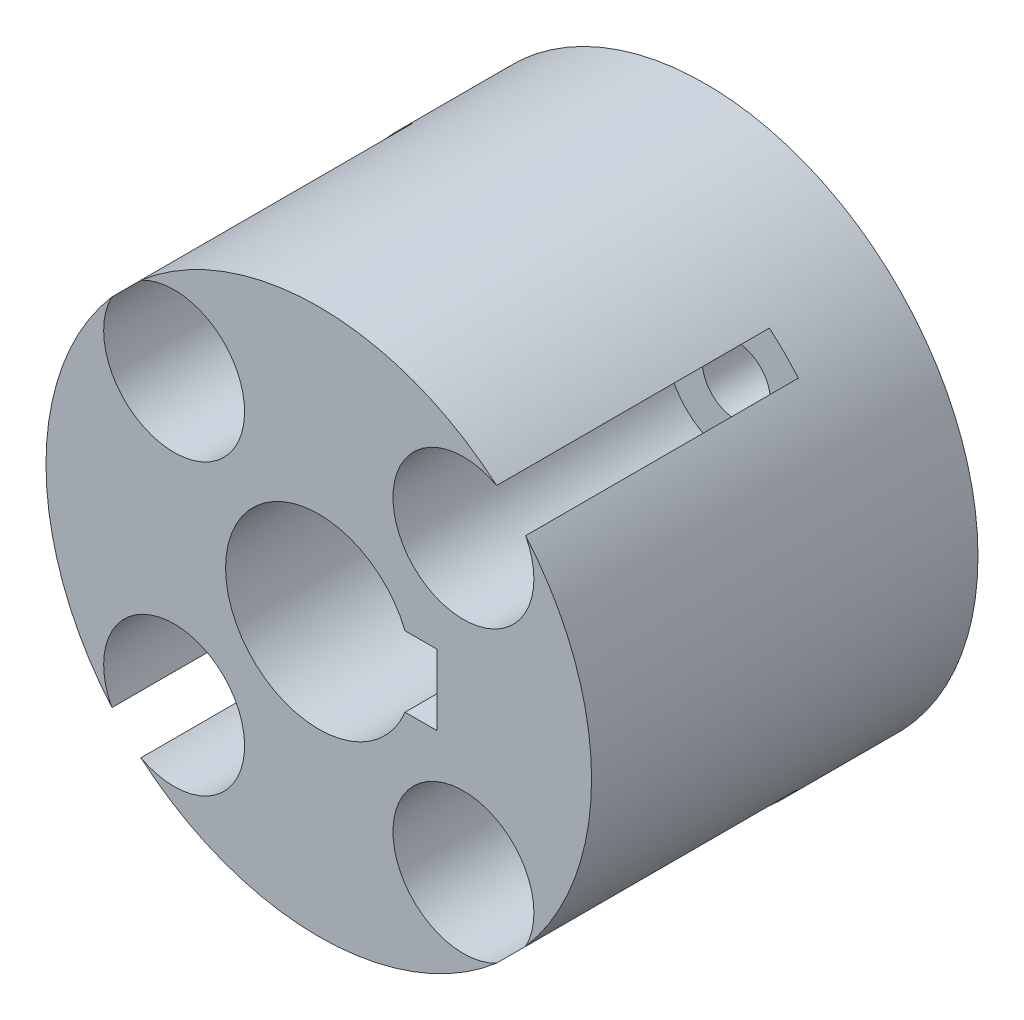
ISO-10303-21;
HEADER;
FILE_DESCRIPTION(('STEP AP214'),'2;1');
FILE_NAME('part.step','',(''),(''),'','','');
FILE_SCHEMA(('AUTOMOTIVE_DESIGN { 1 0 10303 214 1 1 1 1 }'));
ENDSEC;
DATA;
#1=APPLICATION_CONTEXT('core data for automotive mechanical design processes');
#2=APPLICATION_PROTOCOL_DEFINITION('international standard','automotive_design',2000,#1);
#3=PRODUCT_CONTEXT('',#1,'mechanical');
#4=PRODUCT('Part','Part','',(#3));
#5=PRODUCT_RELATED_PRODUCT_CATEGORY('part','',(#4));
#6=PRODUCT_DEFINITION_FORMATION('','',#4);
#7=PRODUCT_DEFINITION_CONTEXT('part definition',#1,'design');
#8=PRODUCT_DEFINITION('design','',#6,#7);
#9=PRODUCT_DEFINITION_SHAPE('','',#8);
#10=(LENGTH_UNIT() NAMED_UNIT(*) SI_UNIT(.MILLI.,.METRE.));
#11=(NAMED_UNIT(*) PLANE_ANGLE_UNIT() SI_UNIT($,.RADIAN.));
#12=(NAMED_UNIT(*) SI_UNIT($,.STERADIAN.) SOLID_ANGLE_UNIT());
#13=UNCERTAINTY_MEASURE_WITH_UNIT(LENGTH_MEASURE(1.E-05),#10,'distance_accuracy_value','');
#14=(GEOMETRIC_REPRESENTATION_CONTEXT(3) GLOBAL_UNCERTAINTY_ASSIGNED_CONTEXT((#13)) GLOBAL_UNIT_ASSIGNED_CONTEXT((#10,
#11,#12)) REPRESENTATION_CONTEXT('',''));
#15=CARTESIAN_POINT('',(0.,0.,0.));
#16=DIRECTION('',(0.,0.,1.));
#17=DIRECTION('',(1.,0.,0.));
#18=AXIS2_PLACEMENT_3D('',#15,#16,#17);
#19=CARTESIAN_POINT('',(-6.363961030679,-6.36396103067885,17.));
#20=DIRECTION('',(0.,0.,-1.));
#21=DIRECTION('',(-1.,0.,0.));
#22=AXIS2_PLACEMENT_3D('',#19,#20,#21);
#23=CYLINDRICAL_SURFACE('',#22,1.5);
#24=CARTESIAN_POINT('',(-6.363961030679,-6.36396103067885,0.));
#25=DIRECTION('',(0.,0.,1.));
#26=DIRECTION('',(1.,0.,0.));
#27=AXIS2_PLACEMENT_3D('',#24,#25,#26);
#28=CIRCLE('',#27,1.5);
#29=CARTESIAN_POINT('',(-4.86396103067901,-6.36396103067885,0.));
#30=VERTEX_POINT('',#29);
#31=EDGE_CURVE('E210',#30,#30,#28,.T.);
#32=ORIENTED_EDGE('',*,*,#31,.F.);
#33=EDGE_LOOP('',(#32));
#34=FACE_BOUND('',#33,.T.);
#35=CARTESIAN_POINT('',(-6.363961030679,-6.36396103067885,5.));
#36=DIRECTION('',(0.,0.,1.));
#37=DIRECTION('',(1.,0.,0.));
#38=AXIS2_PLACEMENT_3D('',#35,#36,#37);
#39=CIRCLE('',#38,1.5);
#40=CARTESIAN_POINT('',(-4.86396103067901,-6.36396103067885,5.));
#41=VERTEX_POINT('',#40);
#42=EDGE_CURVE('E47',#41,#41,#39,.T.);
#43=ORIENTED_EDGE('',*,*,#42,.T.);
#44=EDGE_LOOP('',(#43));
#45=FACE_BOUND('',#44,.T.);
#46=ADVANCED_FACE('F43',(#34,#45),#23,.F.);
#47=CARTESIAN_POINT('',(6.36396103067885,-6.363961030679,17.));
#48=DIRECTION('',(0.,0.,-1.));
#49=DIRECTION('',(-1.,0.,0.));
#50=AXIS2_PLACEMENT_3D('',#47,#48,#49);
#51=CYLINDRICAL_SURFACE('',#50,1.5);
#52=CARTESIAN_POINT('',(6.36396103067885,-6.363961030679,0.));
#53=DIRECTION('',(0.,0.,1.));
#54=DIRECTION('',(1.,0.,0.));
#55=AXIS2_PLACEMENT_3D('',#52,#53,#54);
#56=CIRCLE('',#55,1.5);
#57=CARTESIAN_POINT('',(7.86396103067885,-6.363961030679,0.));
#58=VERTEX_POINT('',#57);
#59=EDGE_CURVE('E207',#58,#58,#56,.T.);
#60=ORIENTED_EDGE('',*,*,#59,.F.);
#61=EDGE_LOOP('',(#60));
#62=FACE_BOUND('',#61,.T.);
#63=CARTESIAN_POINT('',(6.36396103067885,-6.363961030679,5.));
#64=DIRECTION('',(0.,0.,1.));
#65=DIRECTION('',(1.,0.,0.));
#66=AXIS2_PLACEMENT_3D('',#63,#64,#65);
#67=CIRCLE('',#66,1.5);
#68=CARTESIAN_POINT('',(7.86396103067885,-6.363961030679,5.));
#69=VERTEX_POINT('',#68);
#70=EDGE_CURVE('E178',#69,#69,#67,.T.);
#71=ORIENTED_EDGE('',*,*,#70,.T.);
#72=EDGE_LOOP('',(#71));
#73=FACE_BOUND('',#72,.T.);
#74=ADVANCED_FACE('F245',(#62,#73),#51,.F.);
#75=CARTESIAN_POINT('',(6.36396103067901,6.36396103067885,17.));
#76=DIRECTION('',(0.,0.,-1.));
#77=DIRECTION('',(-1.,0.,0.));
#78=AXIS2_PLACEMENT_3D('',#75,#76,#77);
#79=CYLINDRICAL_SURFACE('',#78,1.5);
#80=CARTESIAN_POINT('',(6.36396103067901,6.36396103067885,0.));
#81=DIRECTION('',(0.,0.,1.));
#82=DIRECTION('',(1.,0.,0.));
#83=AXIS2_PLACEMENT_3D('',#80,#81,#82);
#84=CIRCLE('',#83,1.5);
#85=CARTESIAN_POINT('',(7.863961030679,6.36396103067885,0.));
#86=VERTEX_POINT('',#85);
#87=EDGE_CURVE('E204',#86,#86,#84,.T.);
#88=ORIENTED_EDGE('',*,*,#87,.F.);
#89=EDGE_LOOP('',(#88));
#90=FACE_BOUND('',#89,.T.);
#91=CARTESIAN_POINT('',(6.36396103067901,6.36396103067885,5.));
#92=DIRECTION('',(0.,0.,1.));
#93=DIRECTION('',(1.,0.,0.));
#94=AXIS2_PLACEMENT_3D('',#91,#92,#93);
#95=CIRCLE('',#94,1.5);
#96=CARTESIAN_POINT('',(7.863961030679,6.36396103067885,5.));
#97=VERTEX_POINT('',#96);
#98=EDGE_CURVE('E142',#97,#97,#95,.T.);
#99=ORIENTED_EDGE('',*,*,#98,.T.);
#100=EDGE_LOOP('',(#99));
#101=FACE_BOUND('',#100,.T.);
#102=ADVANCED_FACE('F295',(#90,#101),#79,.F.);
#103=CARTESIAN_POINT('',(-6.36396103067885,6.36396103067901,17.));
#104=DIRECTION('',(0.,0.,-1.));
#105=DIRECTION('',(-1.,0.,0.));
#106=AXIS2_PLACEMENT_3D('',#103,#104,#105);
#107=CYLINDRICAL_SURFACE('',#106,1.5);
#108=CARTESIAN_POINT('',(-6.36396103067885,6.36396103067901,0.));
#109=DIRECTION('',(0.,0.,1.));
#110=DIRECTION('',(1.,0.,0.));
#111=AXIS2_PLACEMENT_3D('',#108,#109,#110);
#112=CIRCLE('',#111,1.5);
#113=CARTESIAN_POINT('',(-4.86396103067885,6.36396103067901,0.));
#114=VERTEX_POINT('',#113);
#115=EDGE_CURVE('E183',#114,#114,#112,.T.);
#116=ORIENTED_EDGE('',*,*,#115,.F.);
#117=EDGE_LOOP('',(#116));
#118=FACE_BOUND('',#117,.T.);
#119=CARTESIAN_POINT('',(-6.36396103067885,6.36396103067901,5.));
#120=DIRECTION('',(0.,0.,1.));
#121=DIRECTION('',(1.,0.,0.));
#122=AXIS2_PLACEMENT_3D('',#119,#120,#121);
#123=CIRCLE('',#122,1.5);
#124=CARTESIAN_POINT('',(-4.86396103067885,6.36396103067901,5.));
#125=VERTEX_POINT('',#124);
#126=EDGE_CURVE('E143',#125,#125,#123,.T.);
#127=ORIENTED_EDGE('',*,*,#126,.T.);
#128=EDGE_LOOP('',(#127));
#129=FACE_BOUND('',#128,.T.);
#130=ADVANCED_FACE('F45',(#118,#129),#107,.F.);
#131=CARTESIAN_POINT('',(0.,0.,17.));
#132=DIRECTION('',(0.,0.,-1.));
#133=DIRECTION('',(-1.,0.,0.));
#134=AXIS2_PLACEMENT_3D('',#131,#132,#133);
#135=CYLINDRICAL_SURFACE('',#134,4.1);
#136=CARTESIAN_POINT('',(0.,0.,0.));
#137=DIRECTION('',(0.,0.,1.));
#138=DIRECTION('',(1.,0.,0.));
#139=AXIS2_PLACEMENT_3D('',#136,#137,#138);
#140=CIRCLE('',#139,4.1);
#141=CARTESIAN_POINT('',(3.79572127533095,1.55,0.));
#142=VERTEX_POINT('',#141);
#143=CARTESIAN_POINT('',(3.79572127533095,-1.55,0.));
#144=VERTEX_POINT('',#143);
#145=EDGE_CURVE('E216',#142,#144,#140,.T.);
#146=ORIENTED_EDGE('',*,*,#145,.F.);
#147=DIRECTION('',(0.,0.,-1.));
#148=VECTOR('',#147,1.);
#149=CARTESIAN_POINT('',(3.79572127533095,1.55,17.));
#150=LINE('',#149,#148);
#151=CARTESIAN_POINT('',(3.79572127533095,1.55,17.));
#152=VERTEX_POINT('',#151);
#153=EDGE_CURVE('E232',#152,#142,#150,.T.);
#154=ORIENTED_EDGE('',*,*,#153,.F.);
#155=CARTESIAN_POINT('',(0.,0.,17.));
#156=DIRECTION('',(0.,0.,1.));
#157=DIRECTION('',(1.,0.,0.));
#158=AXIS2_PLACEMENT_3D('',#155,#156,#157);
#159=CIRCLE('',#158,4.1);
#160=CARTESIAN_POINT('',(3.79572127533095,-1.55,17.));
#161=VERTEX_POINT('',#160);
#162=EDGE_CURVE('E190',#152,#161,#159,.T.);
#163=ORIENTED_EDGE('',*,*,#162,.T.);
#164=DIRECTION('',(0.,0.,-1.));
#165=VECTOR('',#164,1.);
#166=CARTESIAN_POINT('',(3.79572127533095,-1.55,17.));
#167=LINE('',#166,#165);
#168=EDGE_CURVE('E201',#161,#144,#167,.T.);
#169=ORIENTED_EDGE('',*,*,#168,.T.);
#170=EDGE_LOOP('',(#146,#154,#163,#169));
#171=FACE_BOUND('',#170,.T.);
#172=ADVANCED_FACE('F307',(#171),#135,.F.);
#173=CARTESIAN_POINT('',(0.,1.55,17.));
#174=DIRECTION('',(0.,1.,0.));
#175=DIRECTION('',(0.,0.,1.));
#176=AXIS2_PLACEMENT_3D('',#173,#174,#175);
#177=PLANE('',#176);
#178=DIRECTION('',(1.,0.,0.));
#179=VECTOR('',#178,1.);
#180=CARTESIAN_POINT('',(0.,1.55,0.));
#181=LINE('',#180,#179);
#182=CARTESIAN_POINT('',(5.2,1.55,0.));
#183=VERTEX_POINT('',#182);
#184=EDGE_CURVE('E219',#142,#183,#181,.T.);
#185=ORIENTED_EDGE('',*,*,#184,.T.);
#186=DIRECTION('',(0.,0.,-1.));
#187=VECTOR('',#186,1.);
#188=CARTESIAN_POINT('',(5.2,1.55,17.));
#189=LINE('',#188,#187);
#190=CARTESIAN_POINT('',(5.2,1.55,17.));
#191=VERTEX_POINT('',#190);
#192=EDGE_CURVE('E230',#191,#183,#189,.T.);
#193=ORIENTED_EDGE('',*,*,#192,.F.);
#194=DIRECTION('',(1.,0.,0.));
#195=VECTOR('',#194,1.);
#196=CARTESIAN_POINT('',(0.,1.55,17.));
#197=LINE('',#196,#195);
#198=EDGE_CURVE('E193',#152,#191,#197,.T.);
#199=ORIENTED_EDGE('',*,*,#198,.F.);
#200=ORIENTED_EDGE('',*,*,#153,.T.);
#201=EDGE_LOOP('',(#185,#193,#199,#200));
#202=FACE_BOUND('',#201,.T.);
#203=ADVANCED_FACE('F339',(#202),#177,.F.);
#204=CARTESIAN_POINT('',(5.2,0.,17.));
#205=DIRECTION('',(-1.,0.,0.));
#206=DIRECTION('',(0.,0.,1.));
#207=AXIS2_PLACEMENT_3D('',#204,#205,#206);
#208=PLANE('',#207);
#209=DIRECTION('',(0.,1.,0.));
#210=VECTOR('',#209,1.);
#211=CARTESIAN_POINT('',(5.2,0.,0.));
#212=LINE('',#211,#210);
#213=CARTESIAN_POINT('',(5.2,-1.55,0.));
#214=VERTEX_POINT('',#213);
#215=EDGE_CURVE('E222',#214,#183,#212,.T.);
#216=ORIENTED_EDGE('',*,*,#215,.F.);
#217=DIRECTION('',(0.,0.,-1.));
#218=VECTOR('',#217,1.);
#219=CARTESIAN_POINT('',(5.2,-1.55,17.));
#220=LINE('',#219,#218);
#221=CARTESIAN_POINT('',(5.2,-1.55,17.));
#222=VERTEX_POINT('',#221);
#223=EDGE_CURVE('E228',#222,#214,#220,.T.);
#224=ORIENTED_EDGE('',*,*,#223,.F.);
#225=DIRECTION('',(0.,1.,0.));
#226=VECTOR('',#225,1.);
#227=CARTESIAN_POINT('',(5.2,0.,17.));
#228=LINE('',#227,#226);
#229=EDGE_CURVE('E195',#222,#191,#228,.T.);
#230=ORIENTED_EDGE('',*,*,#229,.T.);
#231=ORIENTED_EDGE('',*,*,#192,.T.);
#232=EDGE_LOOP('',(#216,#224,#230,#231));
#233=FACE_BOUND('',#232,.T.);
#234=ADVANCED_FACE('F336',(#233),#208,.T.);
#235=CARTESIAN_POINT('',(0.,0.,17.));
#236=DIRECTION('',(0.,0.,-1.));
#237=DIRECTION('',(-1.,0.,0.));
#238=AXIS2_PLACEMENT_3D('',#235,#236,#237);
#239=CYLINDRICAL_SURFACE('',#238,12.);
#240=CARTESIAN_POINT('',(0.,0.,5.));
#241=DIRECTION('',(0.,0.,1.));
#242=DIRECTION('',(1.,0.,0.));
#243=AXIS2_PLACEMENT_3D('',#240,#241,#242);
#244=CIRCLE('',#243,12.);
#245=CARTESIAN_POINT('',(-9.0985721367219,-7.8240644854748,5.));
#246=VERTEX_POINT('',#245);
#247=CARTESIAN_POINT('',(-7.82406448547521,-9.09857213672154,5.));
#248=VERTEX_POINT('',#247);
#249=EDGE_CURVE('E181',#246,#248,#244,.T.);
#250=ORIENTED_EDGE('',*,*,#249,.F.);
#251=DIRECTION('',(0.,0.,1.));
#252=VECTOR('',#251,1.);
#253=CARTESIAN_POINT('',(-9.0985721367219,-7.82406448547479,11.));
#254=LINE('',#253,#252);
#255=CARTESIAN_POINT('',(-9.0985721367219,-7.82406448547479,17.));
#256=VERTEX_POINT('',#255);
#257=EDGE_CURVE('E174',#246,#256,#254,.T.);
#258=ORIENTED_EDGE('',*,*,#257,.T.);
#259=CARTESIAN_POINT('',(0.,0.,17.));
#260=DIRECTION('',(0.,0.,1.));
#261=DIRECTION('',(1.,0.,0.));
#262=AXIS2_PLACEMENT_3D('',#259,#260,#261);
#263=CIRCLE('',#262,12.);
#264=CARTESIAN_POINT('',(-9.09857213672162,7.82406448547512,17.));
#265=VERTEX_POINT('',#264);
#266=EDGE_CURVE('E158',#265,#256,#263,.T.);
#267=ORIENTED_EDGE('',*,*,#266,.F.);
#268=DIRECTION('',(0.,0.,1.));
#269=VECTOR('',#268,1.);
#270=CARTESIAN_POINT('',(-9.09857213672162,7.82406448547511,11.));
#271=LINE('',#270,#269);
#272=CARTESIAN_POINT('',(-9.09857213672162,7.82406448547512,5.));
#273=VERTEX_POINT('',#272);
#274=EDGE_CURVE('E147',#265,#273,#271,.F.);
#275=ORIENTED_EDGE('',*,*,#274,.T.);
#276=CARTESIAN_POINT('',(0.,0.,5.));
#277=DIRECTION('',(0.,0.,1.));
#278=DIRECTION('',(1.,0.,0.));
#279=AXIS2_PLACEMENT_3D('',#276,#277,#278);
#280=CIRCLE('',#279,12.);
#281=CARTESIAN_POINT('',(-7.82406448547489,9.09857213672181,5.));
#282=VERTEX_POINT('',#281);
#283=EDGE_CURVE('E135',#282,#273,#280,.T.);
#284=ORIENTED_EDGE('',*,*,#283,.F.);
#285=DIRECTION('',(0.,0.,1.));
#286=VECTOR('',#285,1.);
#287=CARTESIAN_POINT('',(-7.82406448547489,9.09857213672181,11.));
#288=LINE('',#287,#286);
#289=CARTESIAN_POINT('',(-7.82406448547489,9.09857213672181,17.));
#290=VERTEX_POINT('',#289);
#291=EDGE_CURVE('E149',#282,#290,#288,.T.);
#292=ORIENTED_EDGE('',*,*,#291,.T.);
#293=CARTESIAN_POINT('',(7.82406448547515,9.09857213672159,17.));
#294=VERTEX_POINT('',#293);
#295=EDGE_CURVE('E189',#294,#290,#263,.T.);
#296=ORIENTED_EDGE('',*,*,#295,.F.);
#297=DIRECTION('',(0.,0.,1.));
#298=VECTOR('',#297,1.);
#299=CARTESIAN_POINT('',(7.82406448547515,9.09857213672159,11.));
#300=LINE('',#299,#298);
#301=CARTESIAN_POINT('',(7.82406448547515,9.09857213672159,5.));
#302=VERTEX_POINT('',#301);
#303=EDGE_CURVE('E160',#294,#302,#300,.F.);
#304=ORIENTED_EDGE('',*,*,#303,.T.);
#305=CARTESIAN_POINT('',(0.,0.,5.));
#306=DIRECTION('',(0.,0.,1.));
#307=DIRECTION('',(1.,0.,0.));
#308=AXIS2_PLACEMENT_3D('',#305,#306,#307);
#309=CIRCLE('',#308,12.);
#310=CARTESIAN_POINT('',(9.09857213672184,7.82406448547486,5.));
#311=VERTEX_POINT('',#310);
#312=EDGE_CURVE('E176',#311,#302,#309,.T.);
#313=ORIENTED_EDGE('',*,*,#312,.F.);
#314=DIRECTION('',(0.,0.,1.));
#315=VECTOR('',#314,1.);
#316=CARTESIAN_POINT('',(9.09857213672184,7.82406448547486,11.));
#317=LINE('',#316,#315);
#318=CARTESIAN_POINT('',(9.09857213672184,7.82406448547486,17.));
#319=VERTEX_POINT('',#318);
#320=EDGE_CURVE('E166',#311,#319,#317,.T.);
#321=ORIENTED_EDGE('',*,*,#320,.T.);
#322=CARTESIAN_POINT('',(9.09857213672157,-7.82406448547518,17.));
#323=VERTEX_POINT('',#322);
#324=EDGE_CURVE('E184',#323,#319,#263,.T.);
#325=ORIENTED_EDGE('',*,*,#324,.F.);
#326=DIRECTION('',(0.,0.,1.));
#327=VECTOR('',#326,1.);
#328=CARTESIAN_POINT('',(9.09857213672157,-7.82406448547518,11.));
#329=LINE('',#328,#327);
#330=CARTESIAN_POINT('',(9.09857213672157,-7.82406448547518,5.));
#331=VERTEX_POINT('',#330);
#332=EDGE_CURVE('E60',#323,#331,#329,.F.);
#333=ORIENTED_EDGE('',*,*,#332,.T.);
#334=CARTESIAN_POINT('',(0.,0.,5.));
#335=DIRECTION('',(0.,0.,1.));
#336=DIRECTION('',(1.,0.,0.));
#337=AXIS2_PLACEMENT_3D('',#334,#335,#336);
#338=CIRCLE('',#337,12.);
#339=CARTESIAN_POINT('',(7.82406448547483,-9.09857213672187,5.));
#340=VERTEX_POINT('',#339);
#341=EDGE_CURVE('E179',#340,#331,#338,.T.);
#342=ORIENTED_EDGE('',*,*,#341,.F.);
#343=DIRECTION('',(0.,0.,1.));
#344=VECTOR('',#343,1.);
#345=CARTESIAN_POINT('',(7.82406448547483,-9.09857213672187,11.));
#346=LINE('',#345,#344);
#347=CARTESIAN_POINT('',(7.82406448547483,-9.09857213672187,17.));
#348=VERTEX_POINT('',#347);
#349=EDGE_CURVE('E170',#340,#348,#346,.T.);
#350=ORIENTED_EDGE('',*,*,#349,.T.);
#351=CARTESIAN_POINT('',(-7.82406448547521,-9.09857213672154,17.));
#352=VERTEX_POINT('',#351);
#353=EDGE_CURVE('E187',#352,#348,#263,.T.);
#354=ORIENTED_EDGE('',*,*,#353,.F.);
#355=DIRECTION('',(0.,0.,1.));
#356=VECTOR('',#355,1.);
#357=CARTESIAN_POINT('',(-7.82406448547521,-9.09857213672154,11.));
#358=LINE('',#357,#356);
#359=EDGE_CURVE('E67',#352,#248,#358,.F.);
#360=ORIENTED_EDGE('',*,*,#359,.T.);
#361=EDGE_LOOP('',(#250,#258,#267,#275,#284,#292,#296,#304,#313,#321,#325,#333,#342,#350,#354,#360));
#362=FACE_BOUND('',#361,.T.);
#363=CARTESIAN_POINT('',(0.,0.,0.));
#364=DIRECTION('',(0.,0.,1.));
#365=DIRECTION('',(1.,0.,0.));
#366=AXIS2_PLACEMENT_3D('',#363,#364,#365);
#367=CIRCLE('',#366,12.);
#368=CARTESIAN_POINT('',(12.,0.,0.));
#369=VERTEX_POINT('',#368);
#370=EDGE_CURVE('E213',#369,#369,#367,.T.);
#371=ORIENTED_EDGE('',*,*,#370,.T.);
#372=EDGE_LOOP('',(#371));
#373=FACE_BOUND('',#372,.T.);
#374=ADVANCED_FACE('F154',(#362,#373),#239,.T.);
#375=CARTESIAN_POINT('',(0.,-1.55,17.));
#376=DIRECTION('',(0.,1.,0.));
#377=DIRECTION('',(0.,0.,1.));
#378=AXIS2_PLACEMENT_3D('',#375,#376,#377);
#379=PLANE('',#378);
#380=DIRECTION('',(1.,0.,0.));
#381=VECTOR('',#380,1.);
#382=CARTESIAN_POINT('',(0.,-1.55,0.));
#383=LINE('',#382,#381);
#384=EDGE_CURVE('E188',#144,#214,#383,.T.);
#385=ORIENTED_EDGE('',*,*,#384,.F.);
#386=ORIENTED_EDGE('',*,*,#168,.F.);
#387=DIRECTION('',(1.,0.,0.));
#388=VECTOR('',#387,1.);
#389=CARTESIAN_POINT('',(0.,-1.55,17.));
#390=LINE('',#389,#388);
#391=EDGE_CURVE('E198',#161,#222,#390,.T.);
#392=ORIENTED_EDGE('',*,*,#391,.T.);
#393=ORIENTED_EDGE('',*,*,#223,.T.);
#394=EDGE_LOOP('',(#385,#386,#392,#393));
#395=FACE_BOUND('',#394,.T.);
#396=ADVANCED_FACE('F330',(#395),#379,.T.);
#397=CARTESIAN_POINT('',(0.,0.,17.));
#398=DIRECTION('',(0.,0.,1.));
#399=DIRECTION('',(1.,0.,0.));
#400=AXIS2_PLACEMENT_3D('',#397,#398,#399);
#401=PLANE('',#400);
#402=CARTESIAN_POINT('',(-6.36396103067907,-6.36396103067878,17.));
#403=DIRECTION('',(0.,0.,1.));
#404=DIRECTION('',(1.,0.,0.));
#405=AXIS2_PLACEMENT_3D('',#402,#403,#404);
#406=CIRCLE('',#405,3.1);
#407=EDGE_CURVE('E12',#352,#256,#406,.T.);
#408=ORIENTED_EDGE('',*,*,#407,.F.);
#409=ORIENTED_EDGE('',*,*,#353,.T.);
#410=CARTESIAN_POINT('',(6.36396103067881,-6.36396103067905,17.));
#411=DIRECTION('',(0.,0.,1.));
#412=DIRECTION('',(1.,0.,0.));
#413=AXIS2_PLACEMENT_3D('',#410,#411,#412);
#414=CIRCLE('',#413,3.1);
#415=EDGE_CURVE('E52',#323,#348,#414,.T.);
#416=ORIENTED_EDGE('',*,*,#415,.F.);
#417=ORIENTED_EDGE('',*,*,#324,.T.);
#418=CARTESIAN_POINT('',(6.36396103067903,6.36396103067883,17.));
#419=DIRECTION('',(0.,0.,1.));
#420=DIRECTION('',(1.,0.,0.));
#421=AXIS2_PLACEMENT_3D('',#418,#419,#420);
#422=CIRCLE('',#421,3.1);
#423=EDGE_CURVE('E236',#294,#319,#422,.T.);
#424=ORIENTED_EDGE('',*,*,#423,.F.);
#425=ORIENTED_EDGE('',*,*,#295,.T.);
#426=CARTESIAN_POINT('',(-6.36396103067885,6.36396103067901,17.));
#427=DIRECTION('',(0.,0.,1.));
#428=DIRECTION('',(1.,0.,0.));
#429=AXIS2_PLACEMENT_3D('',#426,#427,#428);
#430=CIRCLE('',#429,3.1);
#431=EDGE_CURVE('E234',#265,#290,#430,.T.);
#432=ORIENTED_EDGE('',*,*,#431,.F.);
#433=ORIENTED_EDGE('',*,*,#266,.T.);
#434=EDGE_LOOP('',(#408,#409,#416,#417,#424,#425,#432,#433));
#435=FACE_BOUND('',#434,.T.);
#436=ORIENTED_EDGE('',*,*,#162,.F.);
#437=ORIENTED_EDGE('',*,*,#198,.T.);
#438=ORIENTED_EDGE('',*,*,#229,.F.);
#439=ORIENTED_EDGE('',*,*,#391,.F.);
#440=EDGE_LOOP('',(#436,#437,#438,#439));
#441=FACE_BOUND('',#440,.T.);
#442=ADVANCED_FACE('F262',(#435,#441),#401,.T.);
#443=CARTESIAN_POINT('',(0.,0.,0.));
#444=DIRECTION('',(0.,0.,1.));
#445=DIRECTION('',(1.,0.,0.));
#446=AXIS2_PLACEMENT_3D('',#443,#444,#445);
#447=PLANE('',#446);
#448=ORIENTED_EDGE('',*,*,#115,.T.);
#449=EDGE_LOOP('',(#448));
#450=FACE_BOUND('',#449,.T.);
#451=ORIENTED_EDGE('',*,*,#87,.T.);
#452=EDGE_LOOP('',(#451));
#453=FACE_BOUND('',#452,.T.);
#454=ORIENTED_EDGE('',*,*,#59,.T.);
#455=EDGE_LOOP('',(#454));
#456=FACE_BOUND('',#455,.T.);
#457=ORIENTED_EDGE('',*,*,#31,.T.);
#458=EDGE_LOOP('',(#457));
#459=FACE_BOUND('',#458,.T.);
#460=ORIENTED_EDGE('',*,*,#370,.F.);
#461=EDGE_LOOP('',(#460));
#462=FACE_BOUND('',#461,.T.);
#463=ORIENTED_EDGE('',*,*,#145,.T.);
#464=ORIENTED_EDGE('',*,*,#384,.T.);
#465=ORIENTED_EDGE('',*,*,#215,.T.);
#466=ORIENTED_EDGE('',*,*,#184,.F.);
#467=EDGE_LOOP('',(#463,#464,#465,#466));
#468=FACE_BOUND('',#467,.T.);
#469=ADVANCED_FACE('F325',(#450,#453,#456,#459,#462,#468),#447,.F.);
#470=CARTESIAN_POINT('',(0.,0.,5.));
#471=DIRECTION('',(0.,0.,1.));
#472=DIRECTION('',(1.,0.,0.));
#473=AXIS2_PLACEMENT_3D('',#470,#471,#472);
#474=PLANE('',#473);
#475=ORIENTED_EDGE('',*,*,#126,.F.);
#476=EDGE_LOOP('',(#475));
#477=FACE_BOUND('',#476,.T.);
#478=ORIENTED_EDGE('',*,*,#283,.T.);
#479=CARTESIAN_POINT('',(-6.36396103067885,6.36396103067901,5.));
#480=DIRECTION('',(0.,0.,1.));
#481=DIRECTION('',(1.,0.,0.));
#482=AXIS2_PLACEMENT_3D('',#479,#480,#481);
#483=CIRCLE('',#482,3.1);
#484=EDGE_CURVE('E138',#282,#273,#483,.F.);
#485=ORIENTED_EDGE('',*,*,#484,.F.);
#486=EDGE_LOOP('',(#478,#485));
#487=FACE_BOUND('',#486,.T.);
#488=ADVANCED_FACE('F137',(#477,#487),#474,.T.);
#489=CARTESIAN_POINT('',(-6.36396103067885,6.36396103067901,-8.76812408671319));
#490=DIRECTION('',(0.,0.,1.));
#491=DIRECTION('',(1.,0.,0.));
#492=AXIS2_PLACEMENT_3D('',#489,#490,#491);
#493=CYLINDRICAL_SURFACE('',#492,3.1);
#494=ORIENTED_EDGE('',*,*,#484,.T.);
#495=ORIENTED_EDGE('',*,*,#274,.F.);
#496=ORIENTED_EDGE('',*,*,#431,.T.);
#497=ORIENTED_EDGE('',*,*,#291,.F.);
#498=EDGE_LOOP('',(#494,#495,#496,#497));
#499=FACE_BOUND('',#498,.T.);
#500=ADVANCED_FACE('F146',(#499),#493,.F.);
#501=CARTESIAN_POINT('',(0.,0.,5.));
#502=DIRECTION('',(0.,0.,1.));
#503=DIRECTION('',(1.,0.,0.));
#504=AXIS2_PLACEMENT_3D('',#501,#502,#503);
#505=PLANE('',#504);
#506=ORIENTED_EDGE('',*,*,#98,.F.);
#507=EDGE_LOOP('',(#506));
#508=FACE_BOUND('',#507,.T.);
#509=ORIENTED_EDGE('',*,*,#312,.T.);
#510=CARTESIAN_POINT('',(6.36396103067903,6.36396103067883,5.));
#511=DIRECTION('',(0.,0.,1.));
#512=DIRECTION('',(1.,0.,0.));
#513=AXIS2_PLACEMENT_3D('',#510,#511,#512);
#514=CIRCLE('',#513,3.1);
#515=EDGE_CURVE('E150',#311,#302,#514,.F.);
#516=ORIENTED_EDGE('',*,*,#515,.F.);
#517=EDGE_LOOP('',(#509,#516));
#518=FACE_BOUND('',#517,.T.);
#519=ADVANCED_FACE('F313',(#508,#518),#505,.T.);
#520=CARTESIAN_POINT('',(6.36396103067903,6.36396103067883,-8.76812408671319));
#521=DIRECTION('',(0.,0.,1.));
#522=DIRECTION('',(1.,0.,0.));
#523=AXIS2_PLACEMENT_3D('',#520,#521,#522);
#524=CYLINDRICAL_SURFACE('',#523,3.1);
#525=ORIENTED_EDGE('',*,*,#515,.T.);
#526=ORIENTED_EDGE('',*,*,#303,.F.);
#527=ORIENTED_EDGE('',*,*,#423,.T.);
#528=ORIENTED_EDGE('',*,*,#320,.F.);
#529=EDGE_LOOP('',(#525,#526,#527,#528));
#530=FACE_BOUND('',#529,.T.);
#531=ADVANCED_FACE('F251',(#530),#524,.F.);
#532=CARTESIAN_POINT('',(0.,0.,5.));
#533=DIRECTION('',(0.,0.,1.));
#534=DIRECTION('',(1.,0.,0.));
#535=AXIS2_PLACEMENT_3D('',#532,#533,#534);
#536=PLANE('',#535);
#537=ORIENTED_EDGE('',*,*,#70,.F.);
#538=EDGE_LOOP('',(#537));
#539=FACE_BOUND('',#538,.T.);
#540=ORIENTED_EDGE('',*,*,#341,.T.);
#541=CARTESIAN_POINT('',(6.36396103067881,-6.36396103067905,5.));
#542=DIRECTION('',(0.,0.,1.));
#543=DIRECTION('',(1.,0.,0.));
#544=AXIS2_PLACEMENT_3D('',#541,#542,#543);
#545=CIRCLE('',#544,3.1);
#546=EDGE_CURVE('E255',#340,#331,#545,.F.);
#547=ORIENTED_EDGE('',*,*,#546,.F.);
#548=EDGE_LOOP('',(#540,#547));
#549=FACE_BOUND('',#548,.T.);
#550=ADVANCED_FACE('F247',(#539,#549),#536,.T.);
#551=CARTESIAN_POINT('',(6.36396103067881,-6.36396103067905,-8.76812408671319));
#552=DIRECTION('',(0.,0.,1.));
#553=DIRECTION('',(1.,0.,0.));
#554=AXIS2_PLACEMENT_3D('',#551,#552,#553);
#555=CYLINDRICAL_SURFACE('',#554,3.1);
#556=ORIENTED_EDGE('',*,*,#546,.T.);
#557=ORIENTED_EDGE('',*,*,#332,.F.);
#558=ORIENTED_EDGE('',*,*,#415,.T.);
#559=ORIENTED_EDGE('',*,*,#349,.F.);
#560=EDGE_LOOP('',(#556,#557,#558,#559));
#561=FACE_BOUND('',#560,.T.);
#562=ADVANCED_FACE('F250',(#561),#555,.F.);
#563=CARTESIAN_POINT('',(0.,0.,5.));
#564=DIRECTION('',(0.,0.,1.));
#565=DIRECTION('',(1.,0.,0.));
#566=AXIS2_PLACEMENT_3D('',#563,#564,#565);
#567=PLANE('',#566);
#568=ORIENTED_EDGE('',*,*,#42,.F.);
#569=EDGE_LOOP('',(#568));
#570=FACE_BOUND('',#569,.T.);
#571=ORIENTED_EDGE('',*,*,#249,.T.);
#572=CARTESIAN_POINT('',(-6.36396103067907,-6.36396103067878,5.));
#573=DIRECTION('',(0.,0.,1.));
#574=DIRECTION('',(1.,0.,0.));
#575=AXIS2_PLACEMENT_3D('',#572,#573,#574);
#576=CIRCLE('',#575,3.1);
#577=EDGE_CURVE('E256',#246,#248,#576,.F.);
#578=ORIENTED_EDGE('',*,*,#577,.F.);
#579=EDGE_LOOP('',(#571,#578));
#580=FACE_BOUND('',#579,.T.);
#581=ADVANCED_FACE('F276',(#570,#580),#567,.T.);
#582=CARTESIAN_POINT('',(-6.36396103067907,-6.36396103067878,-8.76812408671319));
#583=DIRECTION('',(0.,0.,1.));
#584=DIRECTION('',(1.,0.,0.));
#585=AXIS2_PLACEMENT_3D('',#582,#583,#584);
#586=CYLINDRICAL_SURFACE('',#585,3.1);
#587=ORIENTED_EDGE('',*,*,#577,.T.);
#588=ORIENTED_EDGE('',*,*,#359,.F.);
#589=ORIENTED_EDGE('',*,*,#407,.T.);
#590=ORIENTED_EDGE('',*,*,#257,.F.);
#591=EDGE_LOOP('',(#587,#588,#589,#590));
#592=FACE_BOUND('',#591,.T.);
#593=ADVANCED_FACE('F274',(#592),#586,.F.);
#594=CLOSED_SHELL('',(#46,#74,#102,#130,#172,#203,#234,#374,#396,#442,#469,#488,#500,#519,#531,
#550,#562,#581,#593));
#595=MANIFOLD_SOLID_BREP('B2',#594);
#596=ADVANCED_BREP_SHAPE_REPRESENTATION('',(#18,#595),#14);
#597=SHAPE_DEFINITION_REPRESENTATION(#9,#596);
ENDSEC;
END-ISO-10303-21;
